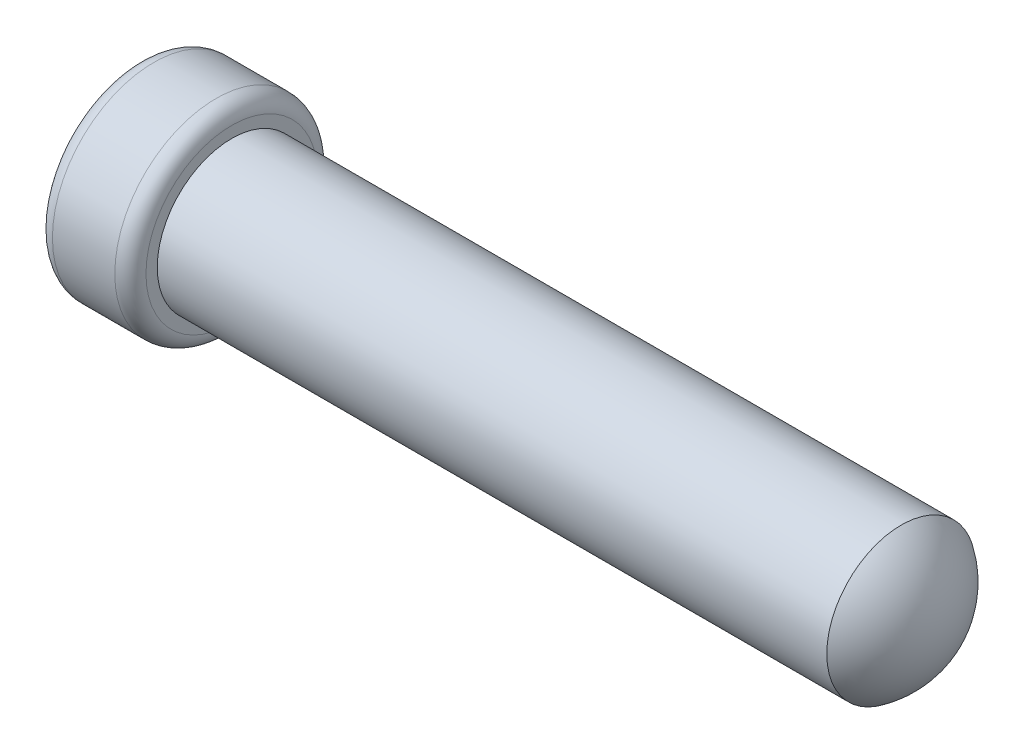
ISO-10303-21;
HEADER;
FILE_DESCRIPTION(('STEP AP214'),'2;1');
FILE_NAME('part.step','',(''),(''),'','','');
FILE_SCHEMA(('AUTOMOTIVE_DESIGN { 1 0 10303 214 1 1 1 1 }'));
ENDSEC;
DATA;
#1=APPLICATION_CONTEXT('core data for automotive mechanical design processes');
#2=APPLICATION_PROTOCOL_DEFINITION('international standard','automotive_design',2000,#1);
#3=PRODUCT_CONTEXT('',#1,'mechanical');
#4=PRODUCT('Part','Part','',(#3));
#5=PRODUCT_RELATED_PRODUCT_CATEGORY('part','',(#4));
#6=PRODUCT_DEFINITION_FORMATION('','',#4);
#7=PRODUCT_DEFINITION_CONTEXT('part definition',#1,'design');
#8=PRODUCT_DEFINITION('design','',#6,#7);
#9=PRODUCT_DEFINITION_SHAPE('','',#8);
#10=(LENGTH_UNIT() NAMED_UNIT(*) SI_UNIT(.MILLI.,.METRE.));
#11=(NAMED_UNIT(*) PLANE_ANGLE_UNIT() SI_UNIT($,.RADIAN.));
#12=(NAMED_UNIT(*) SI_UNIT($,.STERADIAN.) SOLID_ANGLE_UNIT());
#13=UNCERTAINTY_MEASURE_WITH_UNIT(LENGTH_MEASURE(1.E-05),#10,'distance_accuracy_value','');
#14=(GEOMETRIC_REPRESENTATION_CONTEXT(3) GLOBAL_UNCERTAINTY_ASSIGNED_CONTEXT((#13)) GLOBAL_UNIT_ASSIGNED_CONTEXT((#10,
#11,#12)) REPRESENTATION_CONTEXT('',''));
#15=CARTESIAN_POINT('',(0.,0.,0.));
#16=DIRECTION('',(0.,0.,1.));
#17=DIRECTION('',(1.,0.,0.));
#18=AXIS2_PLACEMENT_3D('',#15,#16,#17);
#19=CARTESIAN_POINT('',(0.,0.,0.));
#20=DIRECTION('',(1.,0.,0.));
#21=DIRECTION('',(0.,0.,-1.));
#22=AXIS2_PLACEMENT_3D('',#19,#20,#21);
#23=PLANE('',#22);
#24=CARTESIAN_POINT('',(0.,0.,0.));
#25=DIRECTION('',(-1.,0.,0.));
#26=DIRECTION('',(0.,0.,1.));
#27=AXIS2_PLACEMENT_3D('',#24,#25,#26);
#28=CIRCLE('',#27,0.279400000000002);
#29=CARTESIAN_POINT('',(0.,0.,0.279400000000002));
#30=VERTEX_POINT('',#29);
#31=EDGE_CURVE('E11',#30,#30,#28,.T.);
#32=ORIENTED_EDGE('',*,*,#31,.T.);
#33=EDGE_LOOP('',(#32));
#34=FACE_BOUND('',#33,.T.);
#35=ADVANCED_FACE('F35',(#34),#23,.F.);
#36=CARTESIAN_POINT('',(0.0508,0.,0.));
#37=DIRECTION('',(-1.,0.,0.));
#38=DIRECTION('',(0.,0.,1.));
#39=AXIS2_PLACEMENT_3D('',#36,#37,#38);
#40=TOROIDAL_SURFACE('',#39,0.279400000000003,0.0508);
#41=ORIENTED_EDGE('',*,*,#31,.F.);
#42=EDGE_LOOP('',(#41));
#43=FACE_BOUND('',#42,.T.);
#44=CARTESIAN_POINT('',(0.0508000000000004,0.,0.));
#45=DIRECTION('',(-1.,0.,0.));
#46=DIRECTION('',(0.,0.,1.));
#47=AXIS2_PLACEMENT_3D('',#44,#45,#46);
#48=CIRCLE('',#47,0.330200000000003);
#49=CARTESIAN_POINT('',(0.0508000000000004,0.,0.330200000000003));
#50=VERTEX_POINT('',#49);
#51=EDGE_CURVE('E41',#50,#50,#48,.T.);
#52=ORIENTED_EDGE('',*,*,#51,.T.);
#53=EDGE_LOOP('',(#52));
#54=FACE_BOUND('',#53,.T.);
#55=ADVANCED_FACE('F57',(#43,#54),#40,.T.);
#56=CARTESIAN_POINT('',(-0.343512289125621,0.,0.));
#57=DIRECTION('',(-1.,0.,0.));
#58=DIRECTION('',(0.,0.,1.));
#59=AXIS2_PLACEMENT_3D('',#56,#57,#58);
#60=CYLINDRICAL_SURFACE('',#59,0.330200000000002);
#61=ORIENTED_EDGE('',*,*,#51,.F.);
#62=EDGE_LOOP('',(#61));
#63=FACE_BOUND('',#62,.T.);
#64=CARTESIAN_POINT('',(0.254000000000032,0.,0.));
#65=DIRECTION('',(-1.,0.,0.));
#66=DIRECTION('',(0.,0.,1.));
#67=AXIS2_PLACEMENT_3D('',#64,#65,#66);
#68=CIRCLE('',#67,0.330200000000002);
#69=CARTESIAN_POINT('',(0.254000000000032,0.,0.330200000000002));
#70=VERTEX_POINT('',#69);
#71=EDGE_CURVE('E69',#70,#70,#68,.T.);
#72=ORIENTED_EDGE('',*,*,#71,.T.);
#73=EDGE_LOOP('',(#72));
#74=FACE_BOUND('',#73,.T.);
#75=ADVANCED_FACE('F62',(#63,#74),#60,.T.);
#76=CARTESIAN_POINT('',(0.254000000000033,0.,0.));
#77=DIRECTION('',(-1.,0.,0.));
#78=DIRECTION('',(0.,0.,1.));
#79=AXIS2_PLACEMENT_3D('',#76,#77,#78);
#80=TOROIDAL_SURFACE('',#79,0.279400000000003,0.0508);
#81=ORIENTED_EDGE('',*,*,#71,.F.);
#82=EDGE_LOOP('',(#81));
#83=FACE_BOUND('',#82,.T.);
#84=CARTESIAN_POINT('',(0.304800000000033,0.,0.));
#85=DIRECTION('',(-1.,0.,0.));
#86=DIRECTION('',(0.,0.,1.));
#87=AXIS2_PLACEMENT_3D('',#84,#85,#86);
#88=CIRCLE('',#87,0.279400000000002);
#89=CARTESIAN_POINT('',(0.304800000000033,0.,0.279400000000002));
#90=VERTEX_POINT('',#89);
#91=EDGE_CURVE('E71',#90,#90,#88,.T.);
#92=ORIENTED_EDGE('',*,*,#91,.T.);
#93=EDGE_LOOP('',(#92));
#94=FACE_BOUND('',#93,.T.);
#95=ADVANCED_FACE('F85',(#83,#94),#80,.T.);
#96=CARTESIAN_POINT('',(0.304800000000033,0.24257,0.));
#97=DIRECTION('',(-1.,0.,0.));
#98=DIRECTION('',(0.,0.,1.));
#99=AXIS2_PLACEMENT_3D('',#96,#97,#98);
#100=PLANE('',#99);
#101=ORIENTED_EDGE('',*,*,#91,.F.);
#102=EDGE_LOOP('',(#101));
#103=FACE_BOUND('',#102,.T.);
#104=CARTESIAN_POINT('',(0.304800000000033,0.,0.));
#105=DIRECTION('',(-1.,0.,0.));
#106=DIRECTION('',(0.,0.,1.));
#107=AXIS2_PLACEMENT_3D('',#104,#105,#106);
#108=CIRCLE('',#107,0.24257);
#109=CARTESIAN_POINT('',(0.304800000000033,0.,0.24257));
#110=VERTEX_POINT('',#109);
#111=EDGE_CURVE('E76',#110,#110,#108,.T.);
#112=ORIENTED_EDGE('',*,*,#111,.T.);
#113=EDGE_LOOP('',(#112));
#114=FACE_BOUND('',#113,.T.);
#115=ADVANCED_FACE('F52',(#103,#114),#100,.F.);
#116=CARTESIAN_POINT('',(-0.343512289125621,0.,0.));
#117=DIRECTION('',(-1.,0.,0.));
#118=DIRECTION('',(0.,0.,1.));
#119=AXIS2_PLACEMENT_3D('',#116,#117,#118);
#120=CYLINDRICAL_SURFACE('',#119,0.24257);
#121=ORIENTED_EDGE('',*,*,#111,.F.);
#122=EDGE_LOOP('',(#121));
#123=FACE_BOUND('',#122,.T.);
#124=CARTESIAN_POINT('',(2.48654678347055,0.,0.));
#125=DIRECTION('',(-1.,0.,0.));
#126=DIRECTION('',(0.,0.,1.));
#127=AXIS2_PLACEMENT_3D('',#124,#125,#126);
#128=CIRCLE('',#127,0.24257);
#129=CARTESIAN_POINT('',(2.48654678347055,0.,0.24257));
#130=VERTEX_POINT('',#129);
#131=EDGE_CURVE('E79',#130,#130,#128,.T.);
#132=ORIENTED_EDGE('',*,*,#131,.T.);
#133=EDGE_LOOP('',(#132));
#134=FACE_BOUND('',#133,.T.);
#135=ADVANCED_FACE('F46',(#123,#134),#120,.T.);
#136=CARTESIAN_POINT('',(2.32207989432265,0.,-0.00127195044252603));
#137=DIRECTION('',(0.,-1.,0.));
#138=DIRECTION('',(0.,0.,1.));
#139=AXIS2_PLACEMENT_3D('',#136,#137,#138);
#140=CIRCLE('',#139,0.294122856000011);
#141=TRIMMED_CURVE('',#140,(PARAMETER_VALUE(-1.56647175840032)),
(PARAMETER_VALUE(1.56647175840032)),.T.,.PARAMETER.);
#142=CARTESIAN_POINT('',(2.32207989432265,0.,0.));
#143=DIRECTION('',(-1.,0.,0.));
#144=AXIS1_PLACEMENT('',#142,#143);
#145=SURFACE_OF_REVOLUTION('',#141,#144);
#146=ORIENTED_EDGE('',*,*,#131,.F.);
#147=EDGE_LOOP('',(#146));
#148=FACE_BOUND('',#147,.T.);
#149=CARTESIAN_POINT('',(2.61620000000003,0.,0.));
#150=VERTEX_POINT('',#149);
#151=VERTEX_LOOP('',#150);
#152=FACE_BOUND('',#151,.T.);
#153=ADVANCED_FACE('F44',(#148,#152),#145,.T.);
#154=CLOSED_SHELL('',(#35,#55,#75,#95,#115,#135,#153));
#155=MANIFOLD_SOLID_BREP('B2',#154);
#156=ADVANCED_BREP_SHAPE_REPRESENTATION('',(#18,#155),#14);
#157=SHAPE_DEFINITION_REPRESENTATION(#9,#156);
ENDSEC;
END-ISO-10303-21;
